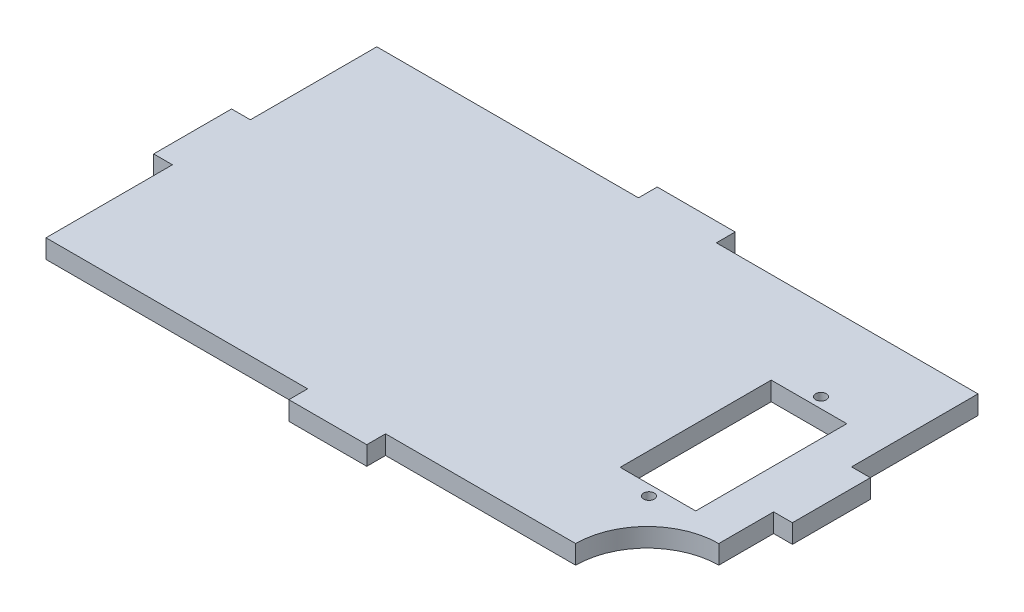
ISO-10303-21;
HEADER;
FILE_DESCRIPTION(('STEP AP214'),'2;1');
FILE_NAME('part.step','',(''),(''),'','','');
FILE_SCHEMA(('AUTOMOTIVE_DESIGN { 1 0 10303 214 1 1 1 1 }'));
ENDSEC;
DATA;
#1=APPLICATION_CONTEXT('core data for automotive mechanical design processes');
#2=APPLICATION_PROTOCOL_DEFINITION('international standard','automotive_design',2000,#1);
#3=PRODUCT_CONTEXT('',#1,'mechanical');
#4=PRODUCT('Part','Part','',(#3));
#5=PRODUCT_RELATED_PRODUCT_CATEGORY('part','',(#4));
#6=PRODUCT_DEFINITION_FORMATION('','',#4);
#7=PRODUCT_DEFINITION_CONTEXT('part definition',#1,'design');
#8=PRODUCT_DEFINITION('design','',#6,#7);
#9=PRODUCT_DEFINITION_SHAPE('','',#8);
#10=(LENGTH_UNIT() NAMED_UNIT(*) SI_UNIT(.MILLI.,.METRE.));
#11=(NAMED_UNIT(*) PLANE_ANGLE_UNIT() SI_UNIT($,.RADIAN.));
#12=(NAMED_UNIT(*) SI_UNIT($,.STERADIAN.) SOLID_ANGLE_UNIT());
#13=UNCERTAINTY_MEASURE_WITH_UNIT(LENGTH_MEASURE(1.E-05),#10,'distance_accuracy_value','');
#14=(GEOMETRIC_REPRESENTATION_CONTEXT(3) GLOBAL_UNCERTAINTY_ASSIGNED_CONTEXT((#13)) GLOBAL_UNIT_ASSIGNED_CONTEXT((#10,
#11,#12)) REPRESENTATION_CONTEXT('',''));
#15=CARTESIAN_POINT('',(0.,0.,0.));
#16=DIRECTION('',(0.,0.,1.));
#17=DIRECTION('',(1.,0.,0.));
#18=AXIS2_PLACEMENT_3D('',#15,#16,#17);
#19=CARTESIAN_POINT('',(41.783,3.,0.));
#20=DIRECTION('',(0.,0.,-1.));
#21=DIRECTION('',(-1.,0.,0.));
#22=AXIS2_PLACEMENT_3D('',#19,#20,#21);
#23=PLANE('',#22);
#24=DIRECTION('',(1.,0.,0.));
#25=VECTOR('',#24,1.);
#26=CARTESIAN_POINT('',(41.783,0.,0.));
#27=LINE('',#26,#25);
#28=CARTESIAN_POINT('',(0.,0.,0.));
#29=VERTEX_POINT('',#28);
#30=CARTESIAN_POINT('',(41.783,0.,0.));
#31=VERTEX_POINT('',#30);
#32=EDGE_CURVE('E318',#29,#31,#27,.T.);
#33=ORIENTED_EDGE('',*,*,#32,.T.);
#34=DIRECTION('',(0.,-1.,0.));
#35=VECTOR('',#34,1.);
#36=CARTESIAN_POINT('',(41.783,3.,0.));
#37=LINE('',#36,#35);
#38=CARTESIAN_POINT('',(41.783,3.,0.));
#39=VERTEX_POINT('',#38);
#40=EDGE_CURVE('E11',#39,#31,#37,.T.);
#41=ORIENTED_EDGE('',*,*,#40,.F.);
#42=DIRECTION('',(1.,0.,0.));
#43=VECTOR('',#42,1.);
#44=CARTESIAN_POINT('',(41.783,3.,0.));
#45=LINE('',#44,#43);
#46=CARTESIAN_POINT('',(0.,3.,0.));
#47=VERTEX_POINT('',#46);
#48=EDGE_CURVE('E253',#47,#39,#45,.T.);
#49=ORIENTED_EDGE('',*,*,#48,.F.);
#50=DIRECTION('',(0.,-1.,0.));
#51=VECTOR('',#50,1.);
#52=CARTESIAN_POINT('',(0.,3.,0.));
#53=LINE('',#52,#51);
#54=EDGE_CURVE('E254',#47,#29,#53,.T.);
#55=ORIENTED_EDGE('',*,*,#54,.T.);
#56=EDGE_LOOP('',(#33,#41,#49,#55));
#57=FACE_BOUND('',#56,.T.);
#58=ADVANCED_FACE('F33',(#57),#23,.F.);
#59=CARTESIAN_POINT('',(41.783,3.,0.));
#60=DIRECTION('',(1.,0.,0.));
#61=DIRECTION('',(0.,0.,-1.));
#62=AXIS2_PLACEMENT_3D('',#59,#60,#61);
#63=PLANE('',#62);
#64=DIRECTION('',(0.,0.,1.));
#65=VECTOR('',#64,1.);
#66=CARTESIAN_POINT('',(41.783,0.,0.));
#67=LINE('',#66,#65);
#68=CARTESIAN_POINT('',(41.783,0.,3.));
#69=VERTEX_POINT('',#68);
#70=EDGE_CURVE('E316',#31,#69,#67,.T.);
#71=ORIENTED_EDGE('',*,*,#70,.T.);
#72=DIRECTION('',(0.,-1.,0.));
#73=VECTOR('',#72,1.);
#74=CARTESIAN_POINT('',(41.783,3.,3.));
#75=LINE('',#74,#73);
#76=CARTESIAN_POINT('',(41.783,3.,3.));
#77=VERTEX_POINT('',#76);
#78=EDGE_CURVE('E40',#77,#69,#75,.T.);
#79=ORIENTED_EDGE('',*,*,#78,.F.);
#80=DIRECTION('',(0.,0.,1.));
#81=VECTOR('',#80,1.);
#82=CARTESIAN_POINT('',(41.783,3.,0.));
#83=LINE('',#82,#81);
#84=EDGE_CURVE('E358',#39,#77,#83,.T.);
#85=ORIENTED_EDGE('',*,*,#84,.F.);
#86=ORIENTED_EDGE('',*,*,#40,.T.);
#87=EDGE_LOOP('',(#71,#79,#85,#86));
#88=FACE_BOUND('',#87,.T.);
#89=ADVANCED_FACE('F439',(#88),#63,.F.);
#90=CARTESIAN_POINT('',(41.783,3.,3.));
#91=DIRECTION('',(0.,0.,-1.));
#92=DIRECTION('',(-1.,0.,0.));
#93=AXIS2_PLACEMENT_3D('',#90,#91,#92);
#94=PLANE('',#93);
#95=DIRECTION('',(1.,0.,0.));
#96=VECTOR('',#95,1.);
#97=CARTESIAN_POINT('',(41.783,0.,3.));
#98=LINE('',#97,#96);
#99=CARTESIAN_POINT('',(54.229,0.,3.));
#100=VERTEX_POINT('',#99);
#101=EDGE_CURVE('E311',#69,#100,#98,.T.);
#102=ORIENTED_EDGE('',*,*,#101,.T.);
#103=DIRECTION('',(0.,-1.,0.));
#104=VECTOR('',#103,1.);
#105=CARTESIAN_POINT('',(54.229,3.,3.));
#106=LINE('',#105,#104);
#107=CARTESIAN_POINT('',(54.229,3.,3.));
#108=VERTEX_POINT('',#107);
#109=EDGE_CURVE('E302',#108,#100,#106,.T.);
#110=ORIENTED_EDGE('',*,*,#109,.F.);
#111=DIRECTION('',(1.,0.,0.));
#112=VECTOR('',#111,1.);
#113=CARTESIAN_POINT('',(41.783,3.,3.));
#114=LINE('',#113,#112);
#115=EDGE_CURVE('E312',#77,#108,#114,.T.);
#116=ORIENTED_EDGE('',*,*,#115,.F.);
#117=ORIENTED_EDGE('',*,*,#78,.T.);
#118=EDGE_LOOP('',(#102,#110,#116,#117));
#119=FACE_BOUND('',#118,.T.);
#120=ADVANCED_FACE('F309',(#119),#94,.F.);
#121=CARTESIAN_POINT('',(54.229,3.,3.));
#122=DIRECTION('',(-1.,0.,0.));
#123=DIRECTION('',(0.,0.,1.));
#124=AXIS2_PLACEMENT_3D('',#121,#122,#123);
#125=PLANE('',#124);
#126=DIRECTION('',(0.,0.,-1.));
#127=VECTOR('',#126,1.);
#128=CARTESIAN_POINT('',(54.229,0.,3.));
#129=LINE('',#128,#127);
#130=CARTESIAN_POINT('',(54.229,0.,0.));
#131=VERTEX_POINT('',#130);
#132=EDGE_CURVE('E224',#100,#131,#129,.T.);
#133=ORIENTED_EDGE('',*,*,#132,.T.);
#134=DIRECTION('',(0.,-1.,0.));
#135=VECTOR('',#134,1.);
#136=CARTESIAN_POINT('',(54.229,3.,0.));
#137=LINE('',#136,#135);
#138=CARTESIAN_POINT('',(54.229,3.,0.));
#139=VERTEX_POINT('',#138);
#140=EDGE_CURVE('E299',#139,#131,#137,.T.);
#141=ORIENTED_EDGE('',*,*,#140,.F.);
#142=DIRECTION('',(0.,0.,-1.));
#143=VECTOR('',#142,1.);
#144=CARTESIAN_POINT('',(54.229,3.,3.));
#145=LINE('',#144,#143);
#146=EDGE_CURVE('E355',#108,#139,#145,.T.);
#147=ORIENTED_EDGE('',*,*,#146,.F.);
#148=ORIENTED_EDGE('',*,*,#109,.T.);
#149=EDGE_LOOP('',(#133,#141,#147,#148));
#150=FACE_BOUND('',#149,.T.);
#151=ADVANCED_FACE('F431',(#150),#125,.F.);
#152=CARTESIAN_POINT('',(96.012,3.,0.));
#153=DIRECTION('',(0.,0.,-1.));
#154=DIRECTION('',(-1.,0.,0.));
#155=AXIS2_PLACEMENT_3D('',#152,#153,#154);
#156=PLANE('',#155);
#157=DIRECTION('',(1.,0.,0.));
#158=VECTOR('',#157,1.);
#159=CARTESIAN_POINT('',(96.012,0.,0.));
#160=LINE('',#159,#158);
#161=CARTESIAN_POINT('',(84.582,0.,0.));
#162=VERTEX_POINT('',#161);
#163=EDGE_CURVE('E220',#131,#162,#160,.T.);
#164=ORIENTED_EDGE('',*,*,#163,.T.);
#165=DIRECTION('',(0.,1.,0.));
#166=VECTOR('',#165,1.);
#167=CARTESIAN_POINT('',(84.582,0.,0.));
#168=LINE('',#167,#166);
#169=CARTESIAN_POINT('',(84.582,3.,0.));
#170=VERTEX_POINT('',#169);
#171=EDGE_CURVE('E47',#162,#170,#168,.T.);
#172=ORIENTED_EDGE('',*,*,#171,.T.);
#173=DIRECTION('',(1.,0.,0.));
#174=VECTOR('',#173,1.);
#175=CARTESIAN_POINT('',(96.012,3.,0.));
#176=LINE('',#175,#174);
#177=EDGE_CURVE('E352',#139,#170,#176,.T.);
#178=ORIENTED_EDGE('',*,*,#177,.F.);
#179=ORIENTED_EDGE('',*,*,#140,.T.);
#180=EDGE_LOOP('',(#164,#172,#178,#179));
#181=FACE_BOUND('',#180,.T.);
#182=ADVANCED_FACE('F429',(#181),#156,.F.);
#183=CARTESIAN_POINT('',(96.012,3.,-20.193));
#184=DIRECTION('',(-1.,0.,0.));
#185=DIRECTION('',(0.,0.,1.));
#186=AXIS2_PLACEMENT_3D('',#183,#184,#185);
#187=PLANE('',#186);
#188=DIRECTION('',(0.,0.,-1.));
#189=VECTOR('',#188,1.);
#190=CARTESIAN_POINT('',(96.012,3.,-20.193));
#191=LINE('',#190,#189);
#192=CARTESIAN_POINT('',(96.012,3.,-11.43));
#193=VERTEX_POINT('',#192);
#194=CARTESIAN_POINT('',(96.012,3.,-20.193));
#195=VERTEX_POINT('',#194);
#196=EDGE_CURVE('E213',#193,#195,#191,.T.);
#197=ORIENTED_EDGE('',*,*,#196,.F.);
#198=DIRECTION('',(0.,1.,0.));
#199=VECTOR('',#198,1.);
#200=CARTESIAN_POINT('',(96.012,0.,-11.43));
#201=LINE('',#200,#199);
#202=CARTESIAN_POINT('',(96.012,0.,-11.43));
#203=VERTEX_POINT('',#202);
#204=EDGE_CURVE('E199',#203,#193,#201,.T.);
#205=ORIENTED_EDGE('',*,*,#204,.F.);
#206=DIRECTION('',(0.,0.,-1.));
#207=VECTOR('',#206,1.);
#208=CARTESIAN_POINT('',(96.012,0.,-20.193));
#209=LINE('',#208,#207);
#210=CARTESIAN_POINT('',(96.012,0.,-20.193));
#211=VERTEX_POINT('',#210);
#212=EDGE_CURVE('E211',#203,#211,#209,.T.);
#213=ORIENTED_EDGE('',*,*,#212,.T.);
#214=DIRECTION('',(0.,-1.,0.));
#215=VECTOR('',#214,1.);
#216=CARTESIAN_POINT('',(96.012,3.,-20.193));
#217=LINE('',#216,#215);
#218=EDGE_CURVE('E297',#195,#211,#217,.T.);
#219=ORIENTED_EDGE('',*,*,#218,.F.);
#220=EDGE_LOOP('',(#197,#205,#213,#219));
#221=FACE_BOUND('',#220,.T.);
#222=ADVANCED_FACE('F209',(#221),#187,.F.);
#223=CARTESIAN_POINT('',(99.012,3.,-20.193));
#224=DIRECTION('',(0.,0.,-1.));
#225=DIRECTION('',(-1.,0.,0.));
#226=AXIS2_PLACEMENT_3D('',#223,#224,#225);
#227=PLANE('',#226);
#228=DIRECTION('',(1.,0.,0.));
#229=VECTOR('',#228,1.);
#230=CARTESIAN_POINT('',(99.012,0.,-20.193));
#231=LINE('',#230,#229);
#232=CARTESIAN_POINT('',(99.012,0.,-20.193));
#233=VERTEX_POINT('',#232);
#234=EDGE_CURVE('E219',#211,#233,#231,.T.);
#235=ORIENTED_EDGE('',*,*,#234,.T.);
#236=DIRECTION('',(0.,-1.,0.));
#237=VECTOR('',#236,1.);
#238=CARTESIAN_POINT('',(99.012,3.,-20.193));
#239=LINE('',#238,#237);
#240=CARTESIAN_POINT('',(99.012,3.,-20.193));
#241=VERTEX_POINT('',#240);
#242=EDGE_CURVE('E294',#241,#233,#239,.T.);
#243=ORIENTED_EDGE('',*,*,#242,.F.);
#244=DIRECTION('',(1.,0.,0.));
#245=VECTOR('',#244,1.);
#246=CARTESIAN_POINT('',(99.012,3.,-20.193));
#247=LINE('',#246,#245);
#248=EDGE_CURVE('E349',#195,#241,#247,.T.);
#249=ORIENTED_EDGE('',*,*,#248,.F.);
#250=ORIENTED_EDGE('',*,*,#218,.T.);
#251=EDGE_LOOP('',(#235,#243,#249,#250));
#252=FACE_BOUND('',#251,.T.);
#253=ADVANCED_FACE('F514',(#252),#227,.F.);
#254=CARTESIAN_POINT('',(99.012,3.,-32.639));
#255=DIRECTION('',(-1.,0.,0.));
#256=DIRECTION('',(0.,0.,1.));
#257=AXIS2_PLACEMENT_3D('',#254,#255,#256);
#258=PLANE('',#257);
#259=DIRECTION('',(0.,0.,-1.));
#260=VECTOR('',#259,1.);
#261=CARTESIAN_POINT('',(99.012,0.,-32.639));
#262=LINE('',#261,#260);
#263=CARTESIAN_POINT('',(99.012,0.,-32.639));
#264=VERTEX_POINT('',#263);
#265=EDGE_CURVE('E222',#233,#264,#262,.T.);
#266=ORIENTED_EDGE('',*,*,#265,.T.);
#267=DIRECTION('',(0.,-1.,0.));
#268=VECTOR('',#267,1.);
#269=CARTESIAN_POINT('',(99.012,3.,-32.639));
#270=LINE('',#269,#268);
#271=CARTESIAN_POINT('',(99.012,3.,-32.639));
#272=VERTEX_POINT('',#271);
#273=EDGE_CURVE('E291',#272,#264,#270,.T.);
#274=ORIENTED_EDGE('',*,*,#273,.F.);
#275=DIRECTION('',(0.,0.,-1.));
#276=VECTOR('',#275,1.);
#277=CARTESIAN_POINT('',(99.012,3.,-32.639));
#278=LINE('',#277,#276);
#279=EDGE_CURVE('E347',#241,#272,#278,.T.);
#280=ORIENTED_EDGE('',*,*,#279,.F.);
#281=ORIENTED_EDGE('',*,*,#242,.T.);
#282=EDGE_LOOP('',(#266,#274,#280,#281));
#283=FACE_BOUND('',#282,.T.);
#284=ADVANCED_FACE('F509',(#283),#258,.F.);
#285=CARTESIAN_POINT('',(96.012,3.,-32.639));
#286=DIRECTION('',(0.,0.,1.));
#287=DIRECTION('',(1.,0.,0.));
#288=AXIS2_PLACEMENT_3D('',#285,#286,#287);
#289=PLANE('',#288);
#290=DIRECTION('',(-1.,0.,0.));
#291=VECTOR('',#290,1.);
#292=CARTESIAN_POINT('',(96.012,0.,-32.639));
#293=LINE('',#292,#291);
#294=CARTESIAN_POINT('',(96.012,0.,-32.639));
#295=VERTEX_POINT('',#294);
#296=EDGE_CURVE('E229',#264,#295,#293,.T.);
#297=ORIENTED_EDGE('',*,*,#296,.T.);
#298=DIRECTION('',(0.,-1.,0.));
#299=VECTOR('',#298,1.);
#300=CARTESIAN_POINT('',(96.012,3.,-32.639));
#301=LINE('',#300,#299);
#302=CARTESIAN_POINT('',(96.012,3.,-32.639));
#303=VERTEX_POINT('',#302);
#304=EDGE_CURVE('E288',#303,#295,#301,.T.);
#305=ORIENTED_EDGE('',*,*,#304,.F.);
#306=DIRECTION('',(-1.,0.,0.));
#307=VECTOR('',#306,1.);
#308=CARTESIAN_POINT('',(96.012,3.,-32.639));
#309=LINE('',#308,#307);
#310=EDGE_CURVE('E345',#272,#303,#309,.T.);
#311=ORIENTED_EDGE('',*,*,#310,.F.);
#312=ORIENTED_EDGE('',*,*,#273,.T.);
#313=EDGE_LOOP('',(#297,#305,#311,#312));
#314=FACE_BOUND('',#313,.T.);
#315=ADVANCED_FACE('F506',(#314),#289,.F.);
#316=CARTESIAN_POINT('',(96.012,3.,-52.832));
#317=DIRECTION('',(-1.,0.,0.));
#318=DIRECTION('',(0.,0.,1.));
#319=AXIS2_PLACEMENT_3D('',#316,#317,#318);
#320=PLANE('',#319);
#321=DIRECTION('',(0.,0.,-1.));
#322=VECTOR('',#321,1.);
#323=CARTESIAN_POINT('',(96.012,0.,-52.832));
#324=LINE('',#323,#322);
#325=CARTESIAN_POINT('',(96.012,0.,-52.832));
#326=VERTEX_POINT('',#325);
#327=EDGE_CURVE('E231',#295,#326,#324,.T.);
#328=ORIENTED_EDGE('',*,*,#327,.T.);
#329=DIRECTION('',(0.,-1.,0.));
#330=VECTOR('',#329,1.);
#331=CARTESIAN_POINT('',(96.012,3.,-52.832));
#332=LINE('',#331,#330);
#333=CARTESIAN_POINT('',(96.012,3.,-52.832));
#334=VERTEX_POINT('',#333);
#335=EDGE_CURVE('E285',#334,#326,#332,.T.);
#336=ORIENTED_EDGE('',*,*,#335,.F.);
#337=DIRECTION('',(0.,0.,-1.));
#338=VECTOR('',#337,1.);
#339=CARTESIAN_POINT('',(96.012,3.,-52.832));
#340=LINE('',#339,#338);
#341=EDGE_CURVE('E343',#303,#334,#340,.T.);
#342=ORIENTED_EDGE('',*,*,#341,.F.);
#343=ORIENTED_EDGE('',*,*,#304,.T.);
#344=EDGE_LOOP('',(#328,#336,#342,#343));
#345=FACE_BOUND('',#344,.T.);
#346=ADVANCED_FACE('F502',(#345),#320,.F.);
#347=CARTESIAN_POINT('',(54.229,3.,-52.832));
#348=DIRECTION('',(0.,0.,1.));
#349=DIRECTION('',(1.,0.,0.));
#350=AXIS2_PLACEMENT_3D('',#347,#348,#349);
#351=PLANE('',#350);
#352=DIRECTION('',(-1.,0.,0.));
#353=VECTOR('',#352,1.);
#354=CARTESIAN_POINT('',(54.229,0.,-52.832));
#355=LINE('',#354,#353);
#356=CARTESIAN_POINT('',(54.229,0.,-52.832));
#357=VERTEX_POINT('',#356);
#358=EDGE_CURVE('E233',#326,#357,#355,.T.);
#359=ORIENTED_EDGE('',*,*,#358,.T.);
#360=DIRECTION('',(0.,-1.,0.));
#361=VECTOR('',#360,1.);
#362=CARTESIAN_POINT('',(54.229,3.,-52.832));
#363=LINE('',#362,#361);
#364=CARTESIAN_POINT('',(54.229,3.,-52.832));
#365=VERTEX_POINT('',#364);
#366=EDGE_CURVE('E282',#365,#357,#363,.T.);
#367=ORIENTED_EDGE('',*,*,#366,.F.);
#368=DIRECTION('',(-1.,0.,0.));
#369=VECTOR('',#368,1.);
#370=CARTESIAN_POINT('',(54.229,3.,-52.832));
#371=LINE('',#370,#369);
#372=EDGE_CURVE('E341',#334,#365,#371,.T.);
#373=ORIENTED_EDGE('',*,*,#372,.F.);
#374=ORIENTED_EDGE('',*,*,#335,.T.);
#375=EDGE_LOOP('',(#359,#367,#373,#374));
#376=FACE_BOUND('',#375,.T.);
#377=ADVANCED_FACE('F497',(#376),#351,.F.);
#378=CARTESIAN_POINT('',(54.229,3.,-52.832));
#379=DIRECTION('',(-1.,0.,0.));
#380=DIRECTION('',(0.,0.,1.));
#381=AXIS2_PLACEMENT_3D('',#378,#379,#380);
#382=PLANE('',#381);
#383=DIRECTION('',(0.,0.,-1.));
#384=VECTOR('',#383,1.);
#385=CARTESIAN_POINT('',(54.229,0.,-52.832));
#386=LINE('',#385,#384);
#387=CARTESIAN_POINT('',(54.229,0.,-55.832));
#388=VERTEX_POINT('',#387);
#389=EDGE_CURVE('E235',#357,#388,#386,.T.);
#390=ORIENTED_EDGE('',*,*,#389,.T.);
#391=DIRECTION('',(0.,-1.,0.));
#392=VECTOR('',#391,1.);
#393=CARTESIAN_POINT('',(54.229,3.,-55.832));
#394=LINE('',#393,#392);
#395=CARTESIAN_POINT('',(54.229,3.,-55.832));
#396=VERTEX_POINT('',#395);
#397=EDGE_CURVE('E279',#396,#388,#394,.T.);
#398=ORIENTED_EDGE('',*,*,#397,.F.);
#399=DIRECTION('',(0.,0.,-1.));
#400=VECTOR('',#399,1.);
#401=CARTESIAN_POINT('',(54.229,3.,-52.832));
#402=LINE('',#401,#400);
#403=EDGE_CURVE('E339',#365,#396,#402,.T.);
#404=ORIENTED_EDGE('',*,*,#403,.F.);
#405=ORIENTED_EDGE('',*,*,#366,.T.);
#406=EDGE_LOOP('',(#390,#398,#404,#405));
#407=FACE_BOUND('',#406,.T.);
#408=ADVANCED_FACE('F491',(#407),#382,.F.);
#409=CARTESIAN_POINT('',(54.229,3.,-55.832));
#410=DIRECTION('',(0.,0.,1.));
#411=DIRECTION('',(1.,0.,0.));
#412=AXIS2_PLACEMENT_3D('',#409,#410,#411);
#413=PLANE('',#412);
#414=DIRECTION('',(-1.,0.,0.));
#415=VECTOR('',#414,1.);
#416=CARTESIAN_POINT('',(54.229,0.,-55.832));
#417=LINE('',#416,#415);
#418=CARTESIAN_POINT('',(41.783,0.,-55.832));
#419=VERTEX_POINT('',#418);
#420=EDGE_CURVE('E237',#388,#419,#417,.T.);
#421=ORIENTED_EDGE('',*,*,#420,.T.);
#422=DIRECTION('',(0.,-1.,0.));
#423=VECTOR('',#422,1.);
#424=CARTESIAN_POINT('',(41.783,3.,-55.832));
#425=LINE('',#424,#423);
#426=CARTESIAN_POINT('',(41.783,3.,-55.832));
#427=VERTEX_POINT('',#426);
#428=EDGE_CURVE('E276',#427,#419,#425,.T.);
#429=ORIENTED_EDGE('',*,*,#428,.F.);
#430=DIRECTION('',(-1.,0.,0.));
#431=VECTOR('',#430,1.);
#432=CARTESIAN_POINT('',(54.229,3.,-55.832));
#433=LINE('',#432,#431);
#434=EDGE_CURVE('E337',#396,#427,#433,.T.);
#435=ORIENTED_EDGE('',*,*,#434,.F.);
#436=ORIENTED_EDGE('',*,*,#397,.T.);
#437=EDGE_LOOP('',(#421,#429,#435,#436));
#438=FACE_BOUND('',#437,.T.);
#439=ADVANCED_FACE('F487',(#438),#413,.F.);
#440=CARTESIAN_POINT('',(41.783,3.,-55.832));
#441=DIRECTION('',(1.,0.,0.));
#442=DIRECTION('',(0.,0.,-1.));
#443=AXIS2_PLACEMENT_3D('',#440,#441,#442);
#444=PLANE('',#443);
#445=DIRECTION('',(0.,0.,1.));
#446=VECTOR('',#445,1.);
#447=CARTESIAN_POINT('',(41.783,0.,-55.832));
#448=LINE('',#447,#446);
#449=CARTESIAN_POINT('',(41.783,0.,-52.832));
#450=VERTEX_POINT('',#449);
#451=EDGE_CURVE('E239',#419,#450,#448,.T.);
#452=ORIENTED_EDGE('',*,*,#451,.T.);
#453=DIRECTION('',(0.,-1.,0.));
#454=VECTOR('',#453,1.);
#455=CARTESIAN_POINT('',(41.783,3.,-52.832));
#456=LINE('',#455,#454);
#457=CARTESIAN_POINT('',(41.783,3.,-52.832));
#458=VERTEX_POINT('',#457);
#459=EDGE_CURVE('E273',#458,#450,#456,.T.);
#460=ORIENTED_EDGE('',*,*,#459,.F.);
#461=DIRECTION('',(0.,0.,1.));
#462=VECTOR('',#461,1.);
#463=CARTESIAN_POINT('',(41.783,3.,-55.832));
#464=LINE('',#463,#462);
#465=EDGE_CURVE('E335',#427,#458,#464,.T.);
#466=ORIENTED_EDGE('',*,*,#465,.F.);
#467=ORIENTED_EDGE('',*,*,#428,.T.);
#468=EDGE_LOOP('',(#452,#460,#466,#467));
#469=FACE_BOUND('',#468,.T.);
#470=ADVANCED_FACE('F482',(#469),#444,.F.);
#471=CARTESIAN_POINT('',(0.,3.,-52.832));
#472=DIRECTION('',(0.,0.,1.));
#473=DIRECTION('',(1.,0.,0.));
#474=AXIS2_PLACEMENT_3D('',#471,#472,#473);
#475=PLANE('',#474);
#476=DIRECTION('',(-1.,0.,0.));
#477=VECTOR('',#476,1.);
#478=CARTESIAN_POINT('',(0.,0.,-52.832));
#479=LINE('',#478,#477);
#480=CARTESIAN_POINT('',(0.,0.,-52.832));
#481=VERTEX_POINT('',#480);
#482=EDGE_CURVE('E241',#450,#481,#479,.T.);
#483=ORIENTED_EDGE('',*,*,#482,.T.);
#484=DIRECTION('',(0.,-1.,0.));
#485=VECTOR('',#484,1.);
#486=CARTESIAN_POINT('',(0.,3.,-52.832));
#487=LINE('',#486,#485);
#488=CARTESIAN_POINT('',(0.,3.,-52.832));
#489=VERTEX_POINT('',#488);
#490=EDGE_CURVE('E270',#489,#481,#487,.T.);
#491=ORIENTED_EDGE('',*,*,#490,.F.);
#492=DIRECTION('',(-1.,0.,0.));
#493=VECTOR('',#492,1.);
#494=CARTESIAN_POINT('',(0.,3.,-52.832));
#495=LINE('',#494,#493);
#496=EDGE_CURVE('E333',#458,#489,#495,.T.);
#497=ORIENTED_EDGE('',*,*,#496,.F.);
#498=ORIENTED_EDGE('',*,*,#459,.T.);
#499=EDGE_LOOP('',(#483,#491,#497,#498));
#500=FACE_BOUND('',#499,.T.);
#501=ADVANCED_FACE('F476',(#500),#475,.F.);
#502=CARTESIAN_POINT('',(0.,3.,-32.639));
#503=DIRECTION('',(1.,0.,0.));
#504=DIRECTION('',(0.,0.,-1.));
#505=AXIS2_PLACEMENT_3D('',#502,#503,#504);
#506=PLANE('',#505);
#507=DIRECTION('',(0.,0.,1.));
#508=VECTOR('',#507,1.);
#509=CARTESIAN_POINT('',(0.,0.,-32.639));
#510=LINE('',#509,#508);
#511=CARTESIAN_POINT('',(0.,0.,-32.639));
#512=VERTEX_POINT('',#511);
#513=EDGE_CURVE('E243',#481,#512,#510,.T.);
#514=ORIENTED_EDGE('',*,*,#513,.T.);
#515=DIRECTION('',(0.,-1.,0.));
#516=VECTOR('',#515,1.);
#517=CARTESIAN_POINT('',(0.,3.,-32.639));
#518=LINE('',#517,#516);
#519=CARTESIAN_POINT('',(0.,3.,-32.639));
#520=VERTEX_POINT('',#519);
#521=EDGE_CURVE('E267',#520,#512,#518,.T.);
#522=ORIENTED_EDGE('',*,*,#521,.F.);
#523=DIRECTION('',(0.,0.,1.));
#524=VECTOR('',#523,1.);
#525=CARTESIAN_POINT('',(0.,3.,-32.639));
#526=LINE('',#525,#524);
#527=EDGE_CURVE('E331',#489,#520,#526,.T.);
#528=ORIENTED_EDGE('',*,*,#527,.F.);
#529=ORIENTED_EDGE('',*,*,#490,.T.);
#530=EDGE_LOOP('',(#514,#522,#528,#529));
#531=FACE_BOUND('',#530,.T.);
#532=ADVANCED_FACE('F472',(#531),#506,.F.);
#533=CARTESIAN_POINT('',(-3.,3.,-32.639));
#534=DIRECTION('',(0.,0.,1.));
#535=DIRECTION('',(1.,0.,0.));
#536=AXIS2_PLACEMENT_3D('',#533,#534,#535);
#537=PLANE('',#536);
#538=DIRECTION('',(-1.,0.,0.));
#539=VECTOR('',#538,1.);
#540=CARTESIAN_POINT('',(-3.,0.,-32.639));
#541=LINE('',#540,#539);
#542=CARTESIAN_POINT('',(-3.,0.,-32.639));
#543=VERTEX_POINT('',#542);
#544=EDGE_CURVE('E245',#512,#543,#541,.T.);
#545=ORIENTED_EDGE('',*,*,#544,.T.);
#546=DIRECTION('',(0.,-1.,0.));
#547=VECTOR('',#546,1.);
#548=CARTESIAN_POINT('',(-3.,3.,-32.639));
#549=LINE('',#548,#547);
#550=CARTESIAN_POINT('',(-3.,3.,-32.639));
#551=VERTEX_POINT('',#550);
#552=EDGE_CURVE('E264',#551,#543,#549,.T.);
#553=ORIENTED_EDGE('',*,*,#552,.F.);
#554=DIRECTION('',(-1.,0.,0.));
#555=VECTOR('',#554,1.);
#556=CARTESIAN_POINT('',(-3.,3.,-32.639));
#557=LINE('',#556,#555);
#558=EDGE_CURVE('E329',#520,#551,#557,.T.);
#559=ORIENTED_EDGE('',*,*,#558,.F.);
#560=ORIENTED_EDGE('',*,*,#521,.T.);
#561=EDGE_LOOP('',(#545,#553,#559,#560));
#562=FACE_BOUND('',#561,.T.);
#563=ADVANCED_FACE('F467',(#562),#537,.F.);
#564=CARTESIAN_POINT('',(-3.,3.,-32.639));
#565=DIRECTION('',(1.,0.,0.));
#566=DIRECTION('',(0.,0.,-1.));
#567=AXIS2_PLACEMENT_3D('',#564,#565,#566);
#568=PLANE('',#567);
#569=DIRECTION('',(0.,0.,1.));
#570=VECTOR('',#569,1.);
#571=CARTESIAN_POINT('',(-3.,0.,-32.639));
#572=LINE('',#571,#570);
#573=CARTESIAN_POINT('',(-3.,0.,-20.193));
#574=VERTEX_POINT('',#573);
#575=EDGE_CURVE('E247',#543,#574,#572,.T.);
#576=ORIENTED_EDGE('',*,*,#575,.T.);
#577=DIRECTION('',(0.,-1.,0.));
#578=VECTOR('',#577,1.);
#579=CARTESIAN_POINT('',(-3.,3.,-20.193));
#580=LINE('',#579,#578);
#581=CARTESIAN_POINT('',(-3.,3.,-20.193));
#582=VERTEX_POINT('',#581);
#583=EDGE_CURVE('E261',#582,#574,#580,.T.);
#584=ORIENTED_EDGE('',*,*,#583,.F.);
#585=DIRECTION('',(0.,0.,1.));
#586=VECTOR('',#585,1.);
#587=CARTESIAN_POINT('',(-3.,3.,-32.639));
#588=LINE('',#587,#586);
#589=EDGE_CURVE('E327',#551,#582,#588,.T.);
#590=ORIENTED_EDGE('',*,*,#589,.F.);
#591=ORIENTED_EDGE('',*,*,#552,.T.);
#592=EDGE_LOOP('',(#576,#584,#590,#591));
#593=FACE_BOUND('',#592,.T.);
#594=ADVANCED_FACE('F461',(#593),#568,.F.);
#595=CARTESIAN_POINT('',(0.,3.,-20.193));
#596=DIRECTION('',(0.,0.,-1.));
#597=DIRECTION('',(-1.,0.,0.));
#598=AXIS2_PLACEMENT_3D('',#595,#596,#597);
#599=PLANE('',#598);
#600=DIRECTION('',(1.,0.,0.));
#601=VECTOR('',#600,1.);
#602=CARTESIAN_POINT('',(0.,0.,-20.193));
#603=LINE('',#602,#601);
#604=CARTESIAN_POINT('',(0.,0.,-20.193));
#605=VERTEX_POINT('',#604);
#606=EDGE_CURVE('E249',#574,#605,#603,.T.);
#607=ORIENTED_EDGE('',*,*,#606,.T.);
#608=DIRECTION('',(0.,-1.,0.));
#609=VECTOR('',#608,1.);
#610=CARTESIAN_POINT('',(0.,3.,-20.193));
#611=LINE('',#610,#609);
#612=CARTESIAN_POINT('',(0.,3.,-20.193));
#613=VERTEX_POINT('',#612);
#614=EDGE_CURVE('E257',#613,#605,#611,.T.);
#615=ORIENTED_EDGE('',*,*,#614,.F.);
#616=DIRECTION('',(1.,0.,0.));
#617=VECTOR('',#616,1.);
#618=CARTESIAN_POINT('',(0.,3.,-20.193));
#619=LINE('',#618,#617);
#620=EDGE_CURVE('E325',#582,#613,#619,.T.);
#621=ORIENTED_EDGE('',*,*,#620,.F.);
#622=ORIENTED_EDGE('',*,*,#583,.T.);
#623=EDGE_LOOP('',(#607,#615,#621,#622));
#624=FACE_BOUND('',#623,.T.);
#625=ADVANCED_FACE('F457',(#624),#599,.F.);
#626=CARTESIAN_POINT('',(0.,3.,0.));
#627=DIRECTION('',(1.,0.,0.));
#628=DIRECTION('',(0.,0.,-1.));
#629=AXIS2_PLACEMENT_3D('',#626,#627,#628);
#630=PLANE('',#629);
#631=DIRECTION('',(0.,0.,1.));
#632=VECTOR('',#631,1.);
#633=CARTESIAN_POINT('',(0.,0.,0.));
#634=LINE('',#633,#632);
#635=EDGE_CURVE('E251',#605,#29,#634,.T.);
#636=ORIENTED_EDGE('',*,*,#635,.T.);
#637=ORIENTED_EDGE('',*,*,#54,.F.);
#638=DIRECTION('',(0.,0.,1.));
#639=VECTOR('',#638,1.);
#640=CARTESIAN_POINT('',(0.,3.,0.));
#641=LINE('',#640,#639);
#642=EDGE_CURVE('E258',#613,#47,#641,.T.);
#643=ORIENTED_EDGE('',*,*,#642,.F.);
#644=ORIENTED_EDGE('',*,*,#614,.T.);
#645=EDGE_LOOP('',(#636,#637,#643,#644));
#646=FACE_BOUND('',#645,.T.);
#647=ADVANCED_FACE('F418',(#646),#630,.F.);
#648=CARTESIAN_POINT('',(0.,3.,0.));
#649=DIRECTION('',(0.,-1.,0.));
#650=DIRECTION('',(0.,0.,-1.));
#651=AXIS2_PLACEMENT_3D('',#648,#649,#650);
#652=PLANE('',#651);
#653=CARTESIAN_POINT('',(83.8708,3.,-12.4206));
#654=DIRECTION('',(0.,1.,0.));
#655=DIRECTION('',(0.,0.,1.));
#656=AXIS2_PLACEMENT_3D('',#653,#654,#655);
#657=CIRCLE('',#656,0.850899999999999);
#658=CARTESIAN_POINT('',(83.8708,3.,-11.5697));
#659=VERTEX_POINT('',#658);
#660=EDGE_CURVE('E400',#659,#659,#657,.T.);
#661=ORIENTED_EDGE('',*,*,#660,.F.);
#662=EDGE_LOOP('',(#661));
#663=FACE_BOUND('',#662,.T.);
#664=CARTESIAN_POINT('',(83.8708,3.,-39.9034));
#665=DIRECTION('',(0.,1.,0.));
#666=DIRECTION('',(0.,0.,1.));
#667=AXIS2_PLACEMENT_3D('',#664,#665,#666);
#668=CIRCLE('',#667,0.850899999999999);
#669=CARTESIAN_POINT('',(83.8708,3.,-39.0525));
#670=VERTEX_POINT('',#669);
#671=EDGE_CURVE('E394',#670,#670,#668,.T.);
#672=ORIENTED_EDGE('',*,*,#671,.F.);
#673=EDGE_LOOP('',(#672));
#674=FACE_BOUND('',#673,.T.);
#675=DIRECTION('',(1.,0.,0.));
#676=VECTOR('',#675,1.);
#677=CARTESIAN_POINT('',(77.597,3.,-14.097));
#678=LINE('',#677,#676);
#679=CARTESIAN_POINT('',(77.597,3.,-14.097));
#680=VERTEX_POINT('',#679);
#681=CARTESIAN_POINT('',(89.662,3.,-14.097));
#682=VERTEX_POINT('',#681);
#683=EDGE_CURVE('E377',#680,#682,#678,.T.);
#684=ORIENTED_EDGE('',*,*,#683,.F.);
#685=DIRECTION('',(0.,0.,1.));
#686=VECTOR('',#685,1.);
#687=CARTESIAN_POINT('',(77.597,3.,-38.227));
#688=LINE('',#687,#686);
#689=CARTESIAN_POINT('',(77.597,3.,-38.227));
#690=VERTEX_POINT('',#689);
#691=EDGE_CURVE('E55',#690,#680,#688,.T.);
#692=ORIENTED_EDGE('',*,*,#691,.F.);
#693=DIRECTION('',(-1.,0.,0.));
#694=VECTOR('',#693,1.);
#695=CARTESIAN_POINT('',(77.597,3.,-38.227));
#696=LINE('',#695,#694);
#697=CARTESIAN_POINT('',(89.662,3.,-38.227));
#698=VERTEX_POINT('',#697);
#699=EDGE_CURVE('E370',#698,#690,#696,.T.);
#700=ORIENTED_EDGE('',*,*,#699,.F.);
#701=DIRECTION('',(0.,0.,-1.));
#702=VECTOR('',#701,1.);
#703=CARTESIAN_POINT('',(89.662,3.,-38.227));
#704=LINE('',#703,#702);
#705=EDGE_CURVE('E374',#682,#698,#704,.T.);
#706=ORIENTED_EDGE('',*,*,#705,.F.);
#707=EDGE_LOOP('',(#684,#692,#700,#706));
#708=FACE_BOUND('',#707,.T.);
#709=ORIENTED_EDGE('',*,*,#177,.T.);
#710=CARTESIAN_POINT('',(96.012,3.,0.));
#711=DIRECTION('',(0.,1.,0.));
#712=DIRECTION('',(0.,0.,-1.));
#713=AXIS2_PLACEMENT_3D('',#710,#711,#712);
#714=CIRCLE('',#713,11.43);
#715=EDGE_CURVE('E205',#193,#170,#714,.T.);
#716=ORIENTED_EDGE('',*,*,#715,.F.);
#717=ORIENTED_EDGE('',*,*,#196,.T.);
#718=ORIENTED_EDGE('',*,*,#248,.T.);
#719=ORIENTED_EDGE('',*,*,#279,.T.);
#720=ORIENTED_EDGE('',*,*,#310,.T.);
#721=ORIENTED_EDGE('',*,*,#341,.T.);
#722=ORIENTED_EDGE('',*,*,#372,.T.);
#723=ORIENTED_EDGE('',*,*,#403,.T.);
#724=ORIENTED_EDGE('',*,*,#434,.T.);
#725=ORIENTED_EDGE('',*,*,#465,.T.);
#726=ORIENTED_EDGE('',*,*,#496,.T.);
#727=ORIENTED_EDGE('',*,*,#527,.T.);
#728=ORIENTED_EDGE('',*,*,#558,.T.);
#729=ORIENTED_EDGE('',*,*,#589,.T.);
#730=ORIENTED_EDGE('',*,*,#620,.T.);
#731=ORIENTED_EDGE('',*,*,#642,.T.);
#732=ORIENTED_EDGE('',*,*,#48,.T.);
#733=ORIENTED_EDGE('',*,*,#84,.T.);
#734=ORIENTED_EDGE('',*,*,#115,.T.);
#735=ORIENTED_EDGE('',*,*,#146,.T.);
#736=EDGE_LOOP('',(#709,#716,#717,#718,#719,#720,#721,#722,#723,#724,#725,#726,#727,#728,#729,
#730,#731,#732,#733,#734,#735));
#737=FACE_BOUND('',#736,.T.);
#738=ADVANCED_FACE('F415',(#663,#674,#708,#737),#652,.F.);
#739=CARTESIAN_POINT('',(0.,0.,0.));
#740=DIRECTION('',(0.,-1.,0.));
#741=DIRECTION('',(0.,0.,-1.));
#742=AXIS2_PLACEMENT_3D('',#739,#740,#741);
#743=PLANE('',#742);
#744=CARTESIAN_POINT('',(83.8708,0.,-12.4206));
#745=DIRECTION('',(0.,1.,0.));
#746=DIRECTION('',(0.,0.,1.));
#747=AXIS2_PLACEMENT_3D('',#744,#745,#746);
#748=CIRCLE('',#747,0.850899999999999);
#749=CARTESIAN_POINT('',(83.8708,0.,-11.5697));
#750=VERTEX_POINT('',#749);
#751=EDGE_CURVE('E397',#750,#750,#748,.T.);
#752=ORIENTED_EDGE('',*,*,#751,.T.);
#753=EDGE_LOOP('',(#752));
#754=FACE_BOUND('',#753,.T.);
#755=CARTESIAN_POINT('',(83.8708,0.,-39.9034));
#756=DIRECTION('',(0.,1.,0.));
#757=DIRECTION('',(0.,0.,1.));
#758=AXIS2_PLACEMENT_3D('',#755,#756,#757);
#759=CIRCLE('',#758,0.850899999999999);
#760=CARTESIAN_POINT('',(83.8708,0.,-39.0525));
#761=VERTEX_POINT('',#760);
#762=EDGE_CURVE('E392',#761,#761,#759,.T.);
#763=ORIENTED_EDGE('',*,*,#762,.T.);
#764=EDGE_LOOP('',(#763));
#765=FACE_BOUND('',#764,.T.);
#766=CARTESIAN_POINT('',(96.012,0.,0.));
#767=DIRECTION('',(0.,1.,0.));
#768=DIRECTION('',(0.,0.,-1.));
#769=AXIS2_PLACEMENT_3D('',#766,#767,#768);
#770=CIRCLE('',#769,11.43);
#771=EDGE_CURVE('E196',#203,#162,#770,.T.);
#772=ORIENTED_EDGE('',*,*,#771,.T.);
#773=ORIENTED_EDGE('',*,*,#163,.F.);
#774=ORIENTED_EDGE('',*,*,#132,.F.);
#775=ORIENTED_EDGE('',*,*,#101,.F.);
#776=ORIENTED_EDGE('',*,*,#70,.F.);
#777=ORIENTED_EDGE('',*,*,#32,.F.);
#778=ORIENTED_EDGE('',*,*,#635,.F.);
#779=ORIENTED_EDGE('',*,*,#606,.F.);
#780=ORIENTED_EDGE('',*,*,#575,.F.);
#781=ORIENTED_EDGE('',*,*,#544,.F.);
#782=ORIENTED_EDGE('',*,*,#513,.F.);
#783=ORIENTED_EDGE('',*,*,#482,.F.);
#784=ORIENTED_EDGE('',*,*,#451,.F.);
#785=ORIENTED_EDGE('',*,*,#420,.F.);
#786=ORIENTED_EDGE('',*,*,#389,.F.);
#787=ORIENTED_EDGE('',*,*,#358,.F.);
#788=ORIENTED_EDGE('',*,*,#327,.F.);
#789=ORIENTED_EDGE('',*,*,#296,.F.);
#790=ORIENTED_EDGE('',*,*,#265,.F.);
#791=ORIENTED_EDGE('',*,*,#234,.F.);
#792=ORIENTED_EDGE('',*,*,#212,.F.);
#793=EDGE_LOOP('',(#772,#773,#774,#775,#776,#777,#778,#779,#780,#781,#782,#783,#784,#785,#786,
#787,#788,#789,#790,#791,#792));
#794=FACE_BOUND('',#793,.T.);
#795=DIRECTION('',(0.,0.,1.));
#796=VECTOR('',#795,1.);
#797=CARTESIAN_POINT('',(77.597,0.,-38.227));
#798=LINE('',#797,#796);
#799=CARTESIAN_POINT('',(77.597,0.,-38.227));
#800=VERTEX_POINT('',#799);
#801=CARTESIAN_POINT('',(77.597,0.,-14.097));
#802=VERTEX_POINT('',#801);
#803=EDGE_CURVE('E373',#800,#802,#798,.T.);
#804=ORIENTED_EDGE('',*,*,#803,.T.);
#805=DIRECTION('',(1.,0.,0.));
#806=VECTOR('',#805,1.);
#807=CARTESIAN_POINT('',(77.597,0.,-14.097));
#808=LINE('',#807,#806);
#809=CARTESIAN_POINT('',(89.662,0.,-14.097));
#810=VERTEX_POINT('',#809);
#811=EDGE_CURVE('E386',#802,#810,#808,.T.);
#812=ORIENTED_EDGE('',*,*,#811,.T.);
#813=DIRECTION('',(0.,0.,-1.));
#814=VECTOR('',#813,1.);
#815=CARTESIAN_POINT('',(89.662,0.,-38.227));
#816=LINE('',#815,#814);
#817=CARTESIAN_POINT('',(89.662,0.,-38.227));
#818=VERTEX_POINT('',#817);
#819=EDGE_CURVE('E383',#810,#818,#816,.T.);
#820=ORIENTED_EDGE('',*,*,#819,.T.);
#821=DIRECTION('',(-1.,0.,0.));
#822=VECTOR('',#821,1.);
#823=CARTESIAN_POINT('',(77.597,0.,-38.227));
#824=LINE('',#823,#822);
#825=EDGE_CURVE('E365',#818,#800,#824,.T.);
#826=ORIENTED_EDGE('',*,*,#825,.T.);
#827=EDGE_LOOP('',(#804,#812,#820,#826));
#828=FACE_BOUND('',#827,.T.);
#829=ADVANCED_FACE('F216',(#754,#765,#794,#828),#743,.T.);
#830=CARTESIAN_POINT('',(77.597,0.,-38.227));
#831=DIRECTION('',(-1.,0.,0.));
#832=DIRECTION('',(0.,0.,1.));
#833=AXIS2_PLACEMENT_3D('',#830,#831,#832);
#834=PLANE('',#833);
#835=ORIENTED_EDGE('',*,*,#691,.T.);
#836=DIRECTION('',(0.,1.,0.));
#837=VECTOR('',#836,1.);
#838=CARTESIAN_POINT('',(77.597,0.,-14.097));
#839=LINE('',#838,#837);
#840=EDGE_CURVE('E362',#802,#680,#839,.T.);
#841=ORIENTED_EDGE('',*,*,#840,.F.);
#842=ORIENTED_EDGE('',*,*,#803,.F.);
#843=DIRECTION('',(0.,1.,0.));
#844=VECTOR('',#843,1.);
#845=CARTESIAN_POINT('',(77.597,0.,-38.227));
#846=LINE('',#845,#844);
#847=EDGE_CURVE('E323',#800,#690,#846,.T.);
#848=ORIENTED_EDGE('',*,*,#847,.T.);
#849=EDGE_LOOP('',(#835,#841,#842,#848));
#850=FACE_BOUND('',#849,.T.);
#851=ADVANCED_FACE('F549',(#850),#834,.F.);
#852=CARTESIAN_POINT('',(77.597,0.,-38.227));
#853=DIRECTION('',(0.,0.,-1.));
#854=DIRECTION('',(-1.,0.,0.));
#855=AXIS2_PLACEMENT_3D('',#852,#853,#854);
#856=PLANE('',#855);
#857=ORIENTED_EDGE('',*,*,#699,.T.);
#858=ORIENTED_EDGE('',*,*,#847,.F.);
#859=ORIENTED_EDGE('',*,*,#825,.F.);
#860=DIRECTION('',(0.,1.,0.));
#861=VECTOR('',#860,1.);
#862=CARTESIAN_POINT('',(89.662,0.,-38.227));
#863=LINE('',#862,#861);
#864=EDGE_CURVE('E367',#818,#698,#863,.T.);
#865=ORIENTED_EDGE('',*,*,#864,.T.);
#866=EDGE_LOOP('',(#857,#858,#859,#865));
#867=FACE_BOUND('',#866,.T.);
#868=ADVANCED_FACE('F553',(#867),#856,.F.);
#869=CARTESIAN_POINT('',(89.662,0.,-38.227));
#870=DIRECTION('',(1.,0.,0.));
#871=DIRECTION('',(0.,0.,-1.));
#872=AXIS2_PLACEMENT_3D('',#869,#870,#871);
#873=PLANE('',#872);
#874=ORIENTED_EDGE('',*,*,#705,.T.);
#875=ORIENTED_EDGE('',*,*,#864,.F.);
#876=ORIENTED_EDGE('',*,*,#819,.F.);
#877=DIRECTION('',(0.,1.,0.));
#878=VECTOR('',#877,1.);
#879=CARTESIAN_POINT('',(89.662,0.,-14.097));
#880=LINE('',#879,#878);
#881=EDGE_CURVE('E364',#810,#682,#880,.T.);
#882=ORIENTED_EDGE('',*,*,#881,.T.);
#883=EDGE_LOOP('',(#874,#875,#876,#882));
#884=FACE_BOUND('',#883,.T.);
#885=ADVANCED_FACE('F557',(#884),#873,.F.);
#886=CARTESIAN_POINT('',(77.597,0.,-14.097));
#887=DIRECTION('',(0.,0.,1.));
#888=DIRECTION('',(1.,0.,0.));
#889=AXIS2_PLACEMENT_3D('',#886,#887,#888);
#890=PLANE('',#889);
#891=ORIENTED_EDGE('',*,*,#683,.T.);
#892=ORIENTED_EDGE('',*,*,#881,.F.);
#893=ORIENTED_EDGE('',*,*,#811,.F.);
#894=ORIENTED_EDGE('',*,*,#840,.T.);
#895=EDGE_LOOP('',(#891,#892,#893,#894));
#896=FACE_BOUND('',#895,.T.);
#897=ADVANCED_FACE('F554',(#896),#890,.F.);
#898=CARTESIAN_POINT('',(96.012,0.,0.));
#899=DIRECTION('',(0.,1.,0.));
#900=DIRECTION('',(0.,0.,1.));
#901=AXIS2_PLACEMENT_3D('',#898,#899,#900);
#902=CYLINDRICAL_SURFACE('',#901,11.43);
#903=ORIENTED_EDGE('',*,*,#715,.T.);
#904=ORIENTED_EDGE('',*,*,#171,.F.);
#905=ORIENTED_EDGE('',*,*,#771,.F.);
#906=ORIENTED_EDGE('',*,*,#204,.T.);
#907=EDGE_LOOP('',(#903,#904,#905,#906));
#908=FACE_BOUND('',#907,.T.);
#909=ADVANCED_FACE('F198',(#908),#902,.F.);
#910=CARTESIAN_POINT('',(83.8708,0.,-39.9034));
#911=DIRECTION('',(0.,1.,0.));
#912=DIRECTION('',(0.,0.,1.));
#913=AXIS2_PLACEMENT_3D('',#910,#911,#912);
#914=CYLINDRICAL_SURFACE('',#913,0.850899999999999);
#915=ORIENTED_EDGE('',*,*,#762,.F.);
#916=EDGE_LOOP('',(#915));
#917=FACE_BOUND('',#916,.T.);
#918=ORIENTED_EDGE('',*,*,#671,.T.);
#919=EDGE_LOOP('',(#918));
#920=FACE_BOUND('',#919,.T.);
#921=ADVANCED_FACE('F411',(#917,#920),#914,.F.);
#922=CARTESIAN_POINT('',(83.8708,0.,-12.4206));
#923=DIRECTION('',(0.,1.,0.));
#924=DIRECTION('',(0.,0.,1.));
#925=AXIS2_PLACEMENT_3D('',#922,#923,#924);
#926=CYLINDRICAL_SURFACE('',#925,0.850899999999999);
#927=ORIENTED_EDGE('',*,*,#751,.F.);
#928=EDGE_LOOP('',(#927));
#929=FACE_BOUND('',#928,.T.);
#930=ORIENTED_EDGE('',*,*,#660,.T.);
#931=EDGE_LOOP('',(#930));
#932=FACE_BOUND('',#931,.T.);
#933=ADVANCED_FACE('F408',(#929,#932),#926,.F.);
#934=CLOSED_SHELL('',(#58,#89,#120,#151,#182,#222,#253,#284,#315,#346,#377,#408,#439,#470,#501,
#532,#563,#594,#625,#647,#738,#829,#851,#868,#885,#897,#909,#921,#933));
#935=MANIFOLD_SOLID_BREP('B2',#934);
#936=ADVANCED_BREP_SHAPE_REPRESENTATION('',(#18,#935),#14);
#937=SHAPE_DEFINITION_REPRESENTATION(#9,#936);
ENDSEC;
END-ISO-10303-21;
